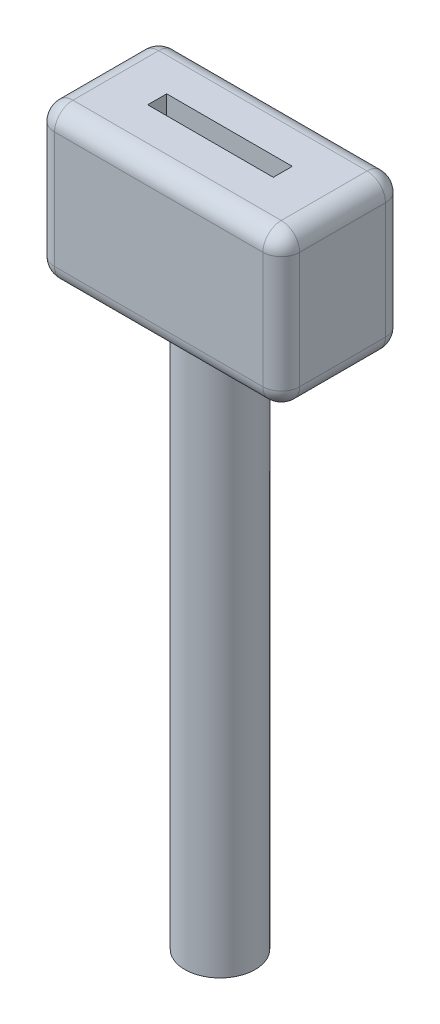
ISO-10303-21;
HEADER;
FILE_DESCRIPTION(('STEP AP214'),'2;1');
FILE_NAME('part.step','',(''),(''),'','','');
FILE_SCHEMA(('AUTOMOTIVE_DESIGN { 1 0 10303 214 1 1 1 1 }'));
ENDSEC;
DATA;
#1=APPLICATION_CONTEXT('core data for automotive mechanical design processes');
#2=APPLICATION_PROTOCOL_DEFINITION('international standard','automotive_design',2000,#1);
#3=PRODUCT_CONTEXT('',#1,'mechanical');
#4=PRODUCT('Part','Part','',(#3));
#5=PRODUCT_RELATED_PRODUCT_CATEGORY('part','',(#4));
#6=PRODUCT_DEFINITION_FORMATION('','',#4);
#7=PRODUCT_DEFINITION_CONTEXT('part definition',#1,'design');
#8=PRODUCT_DEFINITION('design','',#6,#7);
#9=PRODUCT_DEFINITION_SHAPE('','',#8);
#10=(LENGTH_UNIT() NAMED_UNIT(*) SI_UNIT(.MILLI.,.METRE.));
#11=(NAMED_UNIT(*) PLANE_ANGLE_UNIT() SI_UNIT($,.RADIAN.));
#12=(NAMED_UNIT(*) SI_UNIT($,.STERADIAN.) SOLID_ANGLE_UNIT());
#13=UNCERTAINTY_MEASURE_WITH_UNIT(LENGTH_MEASURE(1.E-05),#10,'distance_accuracy_value','');
#14=(GEOMETRIC_REPRESENTATION_CONTEXT(3) GLOBAL_UNCERTAINTY_ASSIGNED_CONTEXT((#13)) GLOBAL_UNIT_ASSIGNED_CONTEXT((#10,
#11,#12)) REPRESENTATION_CONTEXT('',''));
#15=CARTESIAN_POINT('',(0.,0.,0.));
#16=DIRECTION('',(0.,0.,1.));
#17=DIRECTION('',(1.,0.,0.));
#18=AXIS2_PLACEMENT_3D('',#15,#16,#17);
#19=CARTESIAN_POINT('',(0.,90.,0.));
#20=DIRECTION('',(0.,-1.,0.));
#21=DIRECTION('',(0.,0.,-1.));
#22=AXIS2_PLACEMENT_3D('',#19,#20,#21);
#23=CYLINDRICAL_SURFACE('',#22,5.75);
#24=CARTESIAN_POINT('',(0.,90.,0.));
#25=DIRECTION('',(0.,1.,0.));
#26=DIRECTION('',(0.,0.,1.));
#27=AXIS2_PLACEMENT_3D('',#24,#25,#26);
#28=CIRCLE('',#27,5.75);
#29=CARTESIAN_POINT('',(0.,90.,-5.75));
#30=VERTEX_POINT('',#29);
#31=EDGE_CURVE('E214',#30,#30,#28,.T.);
#32=CARTESIAN_POINT('',(0.,0.,0.));
#33=DIRECTION('',(0.,1.,0.));
#34=DIRECTION('',(0.,0.,1.));
#35=AXIS2_PLACEMENT_3D('',#32,#33,#34);
#36=CIRCLE('',#35,5.75);
#37=CARTESIAN_POINT('',(0.,0.,-5.75));
#38=VERTEX_POINT('',#37);
#39=EDGE_CURVE('E208',#38,#38,#36,.T.);
#40=CARTESIAN_POINT('',(0.,90.,-5.75));
#41=CARTESIAN_POINT('',(0.,89.0625,-5.75));
#42=CARTESIAN_POINT('',(0.,88.125,-5.75));
#43=CARTESIAN_POINT('',(0.,86.25,-5.75));
#44=CARTESIAN_POINT('',(0.,85.3125,-5.75));
#45=CARTESIAN_POINT('',(0.,83.4375,-5.75));
#46=CARTESIAN_POINT('',(0.,82.5,-5.75));
#47=CARTESIAN_POINT('',(0.,80.625,-5.75));
#48=CARTESIAN_POINT('',(0.,79.6875,-5.75));
#49=CARTESIAN_POINT('',(0.,77.8125,-5.75));
#50=CARTESIAN_POINT('',(0.,76.875,-5.75));
#51=CARTESIAN_POINT('',(0.,75.,-5.75));
#52=CARTESIAN_POINT('',(0.,74.0625,-5.75));
#53=CARTESIAN_POINT('',(0.,72.1875,-5.75));
#54=CARTESIAN_POINT('',(0.,71.25,-5.75));
#55=CARTESIAN_POINT('',(0.,69.375,-5.75));
#56=CARTESIAN_POINT('',(0.,68.4375,-5.75));
#57=CARTESIAN_POINT('',(0.,66.5625,-5.75));
#58=CARTESIAN_POINT('',(0.,65.625,-5.75));
#59=CARTESIAN_POINT('',(0.,63.75,-5.75));
#60=CARTESIAN_POINT('',(0.,62.8125,-5.75));
#61=CARTESIAN_POINT('',(0.,60.9375,-5.75));
#62=CARTESIAN_POINT('',(0.,60.,-5.75));
#63=CARTESIAN_POINT('',(0.,58.125,-5.75));
#64=CARTESIAN_POINT('',(0.,57.1875,-5.75));
#65=CARTESIAN_POINT('',(0.,55.3125,-5.75));
#66=CARTESIAN_POINT('',(0.,54.375,-5.75));
#67=CARTESIAN_POINT('',(0.,52.5,-5.75));
#68=CARTESIAN_POINT('',(0.,51.5625,-5.75));
#69=CARTESIAN_POINT('',(0.,49.6875,-5.75));
#70=CARTESIAN_POINT('',(0.,48.75,-5.75));
#71=CARTESIAN_POINT('',(0.,46.875,-5.75));
#72=CARTESIAN_POINT('',(0.,45.9375,-5.75));
#73=CARTESIAN_POINT('',(0.,44.0625,-5.75));
#74=CARTESIAN_POINT('',(0.,43.125,-5.75));
#75=CARTESIAN_POINT('',(0.,41.25,-5.75));
#76=CARTESIAN_POINT('',(0.,40.3125,-5.75));
#77=CARTESIAN_POINT('',(0.,38.4375,-5.75));
#78=CARTESIAN_POINT('',(0.,37.5,-5.75));
#79=CARTESIAN_POINT('',(0.,35.625,-5.75));
#80=CARTESIAN_POINT('',(0.,34.6875,-5.75));
#81=CARTESIAN_POINT('',(0.,32.8125,-5.75));
#82=CARTESIAN_POINT('',(0.,31.875,-5.75));
#83=CARTESIAN_POINT('',(0.,30.,-5.75));
#84=CARTESIAN_POINT('',(0.,29.0625,-5.75));
#85=CARTESIAN_POINT('',(0.,27.1875,-5.75));
#86=CARTESIAN_POINT('',(0.,26.25,-5.75));
#87=CARTESIAN_POINT('',(0.,24.375,-5.75));
#88=CARTESIAN_POINT('',(0.,23.4375,-5.75));
#89=CARTESIAN_POINT('',(0.,21.5625,-5.75));
#90=CARTESIAN_POINT('',(0.,20.625,-5.75));
#91=CARTESIAN_POINT('',(0.,18.75,-5.75));
#92=CARTESIAN_POINT('',(0.,17.8125,-5.75));
#93=CARTESIAN_POINT('',(0.,15.9375,-5.75));
#94=CARTESIAN_POINT('',(0.,15.,-5.75));
#95=CARTESIAN_POINT('',(0.,13.125,-5.75));
#96=CARTESIAN_POINT('',(0.,12.1875,-5.75));
#97=CARTESIAN_POINT('',(0.,10.3125,-5.75));
#98=CARTESIAN_POINT('',(0.,9.37499999999999,-5.75));
#99=CARTESIAN_POINT('',(0.,7.49999999999999,-5.75));
#100=CARTESIAN_POINT('',(0.,6.56249999999999,-5.75));
#101=CARTESIAN_POINT('',(0.,4.68749999999999,-5.75));
#102=CARTESIAN_POINT('',(0.,3.74999999999998,-5.75));
#103=CARTESIAN_POINT('',(0.,1.87499999999998,-5.75));
#104=CARTESIAN_POINT('',(0.,0.937499999999986,-5.75));
#105=CARTESIAN_POINT('',(0.,0.,-5.75));
#106=B_SPLINE_CURVE_WITH_KNOTS('',3,(#40,#41,#42,#43,#44,#45,#46,#47,#48,#49,#50,#51,#52,#53,
#54,#55,#56,#57,#58,#59,#60,#61,#62,#63,#64,#65,#66,#67,#68,#69,#70,#71,#72,#73,#74,#75,#76,#77,
#78,#79,#80,#81,#82,#83,#84,#85,#86,#87,#88,#89,#90,#91,#92,#93,#94,#95,#96,#97,#98,#99,#100,
#101,#102,#103,#104,#105),.UNSPECIFIED.,.F.,.F.,(4,2,2,2,2,2,2,2,2,2,2,2,2,2,2,2,2,2,2,2,2,2,2,
2,2,2,2,2,2,2,2,2,4),(0.,2.81250000000001,5.62500000000001,8.43750000000001,11.25,14.0625,
16.875,19.6875,22.5,25.3125,28.125,30.9375,33.75,36.5625,39.375,42.1875,45.,47.8125,50.625,
53.4375,56.25,59.0625,61.875,64.6875,67.5,70.3125,73.125,75.9375,78.75,81.5625,84.375,87.1875,
90.),.UNSPECIFIED.);
#107=EDGE_CURVE('BSEAM45',#30,#38,#106,.T.);
#108=ORIENTED_EDGE('',*,*,#31,.F.);
#109=ORIENTED_EDGE('',*,*,#39,.T.);
#110=ORIENTED_EDGE('',*,*,#107,.T.);
#111=ORIENTED_EDGE('',*,*,#107,.F.);
#112=EDGE_LOOP('',(#108,#110,#109,#111));
#113=FACE_BOUND('',#112,.T.);
#114=ADVANCED_FACE('F45',(#113),#23,.T.);
#115=CARTESIAN_POINT('',(0.,0.,0.));
#116=DIRECTION('',(0.,1.,0.));
#117=DIRECTION('',(0.,0.,1.));
#118=AXIS2_PLACEMENT_3D('',#115,#116,#117);
#119=PLANE('',#118);
#120=ORIENTED_EDGE('',*,*,#39,.F.);
#121=EDGE_LOOP('',(#120));
#122=FACE_BOUND('',#121,.T.);
#123=ADVANCED_FACE('F476',(#122),#119,.F.);
#124=CARTESIAN_POINT('',(20.,115.,10.));
#125=DIRECTION('',(-1.,0.,0.));
#126=DIRECTION('',(0.,0.,1.));
#127=AXIS2_PLACEMENT_3D('',#124,#125,#126);
#128=PLANE('',#127);
#129=DIRECTION('',(0.,0.,-1.));
#130=VECTOR('',#129,1.);
#131=CARTESIAN_POINT('',(20.,93.,-10.));
#132=LINE('',#131,#130);
#133=CARTESIAN_POINT('',(20.,93.,7.));
#134=VERTEX_POINT('',#133);
#135=CARTESIAN_POINT('',(20.,93.,-7.));
#136=VERTEX_POINT('',#135);
#137=EDGE_CURVE('E263',#134,#136,#132,.T.);
#138=ORIENTED_EDGE('',*,*,#137,.T.);
#139=DIRECTION('',(0.,-1.,0.));
#140=VECTOR('',#139,1.);
#141=CARTESIAN_POINT('',(20.,115.,-7.));
#142=LINE('',#141,#140);
#143=CARTESIAN_POINT('',(20.,112.,-7.));
#144=VERTEX_POINT('',#143);
#145=EDGE_CURVE('E270',#136,#144,#142,.F.);
#146=ORIENTED_EDGE('',*,*,#145,.T.);
#147=DIRECTION('',(0.,0.,-1.));
#148=VECTOR('',#147,1.);
#149=CARTESIAN_POINT('',(20.,112.,10.));
#150=LINE('',#149,#148);
#151=CARTESIAN_POINT('',(20.,112.,7.));
#152=VERTEX_POINT('',#151);
#153=EDGE_CURVE('E266',#144,#152,#150,.F.);
#154=ORIENTED_EDGE('',*,*,#153,.T.);
#155=DIRECTION('',(0.,-1.,0.));
#156=VECTOR('',#155,1.);
#157=CARTESIAN_POINT('',(20.,115.,7.));
#158=LINE('',#157,#156);
#159=EDGE_CURVE('E260',#152,#134,#158,.T.);
#160=ORIENTED_EDGE('',*,*,#159,.T.);
#161=EDGE_LOOP('',(#138,#146,#154,#160));
#162=FACE_BOUND('',#161,.T.);
#163=ADVANCED_FACE('F428',(#162),#128,.F.);
#164=CARTESIAN_POINT('',(-20.,115.,-10.));
#165=DIRECTION('',(0.,0.,1.));
#166=DIRECTION('',(1.,0.,0.));
#167=AXIS2_PLACEMENT_3D('',#164,#165,#166);
#168=PLANE('',#167);
#169=DIRECTION('',(-1.,0.,0.));
#170=VECTOR('',#169,1.);
#171=CARTESIAN_POINT('',(-20.,112.,-10.));
#172=LINE('',#171,#170);
#173=CARTESIAN_POINT('',(-17.,112.,-10.));
#174=VERTEX_POINT('',#173);
#175=CARTESIAN_POINT('',(17.,112.,-10.));
#176=VERTEX_POINT('',#175);
#177=EDGE_CURVE('E279',#174,#176,#172,.F.);
#178=ORIENTED_EDGE('',*,*,#177,.T.);
#179=DIRECTION('',(0.,-1.,0.));
#180=VECTOR('',#179,1.);
#181=CARTESIAN_POINT('',(17.,115.,-10.));
#182=LINE('',#181,#180);
#183=CARTESIAN_POINT('',(17.,93.,-10.));
#184=VERTEX_POINT('',#183);
#185=EDGE_CURVE('E282',#176,#184,#182,.T.);
#186=ORIENTED_EDGE('',*,*,#185,.T.);
#187=DIRECTION('',(-1.,0.,0.));
#188=VECTOR('',#187,1.);
#189=CARTESIAN_POINT('',(-20.,93.,-10.));
#190=LINE('',#189,#188);
#191=CARTESIAN_POINT('',(-17.,93.,-10.));
#192=VERTEX_POINT('',#191);
#193=EDGE_CURVE('E273',#184,#192,#190,.T.);
#194=ORIENTED_EDGE('',*,*,#193,.T.);
#195=DIRECTION('',(0.,-1.,0.));
#196=VECTOR('',#195,1.);
#197=CARTESIAN_POINT('',(-17.,115.,-10.));
#198=LINE('',#197,#196);
#199=EDGE_CURVE('E276',#192,#174,#198,.F.);
#200=ORIENTED_EDGE('',*,*,#199,.T.);
#201=EDGE_LOOP('',(#178,#186,#194,#200));
#202=FACE_BOUND('',#201,.T.);
#203=ADVANCED_FACE('F399',(#202),#168,.F.);
#204=CARTESIAN_POINT('',(-20.,115.,10.));
#205=DIRECTION('',(1.,0.,0.));
#206=DIRECTION('',(0.,0.,-1.));
#207=AXIS2_PLACEMENT_3D('',#204,#205,#206);
#208=PLANE('',#207);
#209=DIRECTION('',(0.,0.,1.));
#210=VECTOR('',#209,1.);
#211=CARTESIAN_POINT('',(-20.,112.,10.));
#212=LINE('',#211,#210);
#213=CARTESIAN_POINT('',(-20.,112.,7.));
#214=VERTEX_POINT('',#213);
#215=CARTESIAN_POINT('',(-20.,112.,-7.));
#216=VERTEX_POINT('',#215);
#217=EDGE_CURVE('E240',#214,#216,#212,.F.);
#218=ORIENTED_EDGE('',*,*,#217,.T.);
#219=DIRECTION('',(0.,-1.,0.));
#220=VECTOR('',#219,1.);
#221=CARTESIAN_POINT('',(-20.,115.,-7.));
#222=LINE('',#221,#220);
#223=CARTESIAN_POINT('',(-20.,93.,-7.));
#224=VERTEX_POINT('',#223);
#225=EDGE_CURVE('E244',#216,#224,#222,.T.);
#226=ORIENTED_EDGE('',*,*,#225,.T.);
#227=DIRECTION('',(0.,0.,1.));
#228=VECTOR('',#227,1.);
#229=CARTESIAN_POINT('',(-20.,93.,10.));
#230=LINE('',#229,#228);
#231=CARTESIAN_POINT('',(-20.,93.,7.));
#232=VERTEX_POINT('',#231);
#233=EDGE_CURVE('E237',#224,#232,#230,.T.);
#234=ORIENTED_EDGE('',*,*,#233,.T.);
#235=DIRECTION('',(0.,-1.,0.));
#236=VECTOR('',#235,1.);
#237=CARTESIAN_POINT('',(-20.,115.,7.));
#238=LINE('',#237,#236);
#239=EDGE_CURVE('E234',#232,#214,#238,.F.);
#240=ORIENTED_EDGE('',*,*,#239,.T.);
#241=EDGE_LOOP('',(#218,#226,#234,#240));
#242=FACE_BOUND('',#241,.T.);
#243=ADVANCED_FACE('F694',(#242),#208,.F.);
#244=CARTESIAN_POINT('',(-20.,115.,10.));
#245=DIRECTION('',(0.,0.,-1.));
#246=DIRECTION('',(-1.,0.,0.));
#247=AXIS2_PLACEMENT_3D('',#244,#245,#246);
#248=PLANE('',#247);
#249=DIRECTION('',(1.,0.,0.));
#250=VECTOR('',#249,1.);
#251=CARTESIAN_POINT('',(-20.,112.,10.));
#252=LINE('',#251,#250);
#253=CARTESIAN_POINT('',(17.,112.,10.));
#254=VERTEX_POINT('',#253);
#255=CARTESIAN_POINT('',(-17.,112.,10.));
#256=VERTEX_POINT('',#255);
#257=EDGE_CURVE('E55',#254,#256,#252,.F.);
#258=ORIENTED_EDGE('',*,*,#257,.T.);
#259=DIRECTION('',(0.,-1.,0.));
#260=VECTOR('',#259,1.);
#261=CARTESIAN_POINT('',(-17.,115.,10.));
#262=LINE('',#261,#260);
#263=CARTESIAN_POINT('',(-17.,93.,10.));
#264=VERTEX_POINT('',#263);
#265=EDGE_CURVE('E11',#256,#264,#262,.T.);
#266=ORIENTED_EDGE('',*,*,#265,.T.);
#267=DIRECTION('',(1.,0.,0.));
#268=VECTOR('',#267,1.);
#269=CARTESIAN_POINT('',(20.,93.,10.));
#270=LINE('',#269,#268);
#271=CARTESIAN_POINT('',(17.,93.,10.));
#272=VERTEX_POINT('',#271);
#273=EDGE_CURVE('E286',#264,#272,#270,.T.);
#274=ORIENTED_EDGE('',*,*,#273,.T.);
#275=DIRECTION('',(0.,-1.,0.));
#276=VECTOR('',#275,1.);
#277=CARTESIAN_POINT('',(17.,115.,10.));
#278=LINE('',#277,#276);
#279=EDGE_CURVE('E66',#272,#254,#278,.F.);
#280=ORIENTED_EDGE('',*,*,#279,.T.);
#281=EDGE_LOOP('',(#258,#266,#274,#280));
#282=FACE_BOUND('',#281,.T.);
#283=ADVANCED_FACE('F686',(#282),#248,.F.);
#284=CARTESIAN_POINT('',(0.,115.,0.));
#285=DIRECTION('',(0.,-1.,0.));
#286=DIRECTION('',(0.,0.,-1.));
#287=AXIS2_PLACEMENT_3D('',#284,#285,#286);
#288=PLANE('',#287);
#289=DIRECTION('',(0.,0.,-1.));
#290=VECTOR('',#289,1.);
#291=CARTESIAN_POINT('',(17.,115.,0.));
#292=LINE('',#291,#290);
#293=CARTESIAN_POINT('',(17.,115.,7.));
#294=VERTEX_POINT('',#293);
#295=CARTESIAN_POINT('',(17.,115.,-7.));
#296=VERTEX_POINT('',#295);
#297=EDGE_CURVE('E224',#294,#296,#292,.T.);
#298=ORIENTED_EDGE('',*,*,#297,.T.);
#299=DIRECTION('',(-1.,0.,0.));
#300=VECTOR('',#299,1.);
#301=CARTESIAN_POINT('',(0.,115.,-7.));
#302=LINE('',#301,#300);
#303=CARTESIAN_POINT('',(-17.,115.,-7.));
#304=VERTEX_POINT('',#303);
#305=EDGE_CURVE('E231',#296,#304,#302,.T.);
#306=ORIENTED_EDGE('',*,*,#305,.T.);
#307=DIRECTION('',(0.,0.,1.));
#308=VECTOR('',#307,1.);
#309=CARTESIAN_POINT('',(-17.,115.,0.));
#310=LINE('',#309,#308);
#311=CARTESIAN_POINT('',(-17.,115.,7.));
#312=VERTEX_POINT('',#311);
#313=EDGE_CURVE('E227',#304,#312,#310,.T.);
#314=ORIENTED_EDGE('',*,*,#313,.T.);
#315=DIRECTION('',(1.,0.,0.));
#316=VECTOR('',#315,1.);
#317=CARTESIAN_POINT('',(0.,115.,7.));
#318=LINE('',#317,#316);
#319=EDGE_CURVE('E218',#312,#294,#318,.T.);
#320=ORIENTED_EDGE('',*,*,#319,.T.);
#321=EDGE_LOOP('',(#298,#306,#314,#320));
#322=FACE_BOUND('',#321,.T.);
#323=DIRECTION('',(-1.,0.,0.));
#324=VECTOR('',#323,1.);
#325=CARTESIAN_POINT('',(-10.25,115.,-1.55));
#326=LINE('',#325,#324);
#327=CARTESIAN_POINT('',(10.25,115.,-1.55));
#328=VERTEX_POINT('',#327);
#329=CARTESIAN_POINT('',(-10.25,115.,-1.55));
#330=VERTEX_POINT('',#329);
#331=EDGE_CURVE('E199',#328,#330,#326,.T.);
#332=ORIENTED_EDGE('',*,*,#331,.F.);
#333=DIRECTION('',(0.,0.,-1.));
#334=VECTOR('',#333,1.);
#335=CARTESIAN_POINT('',(10.25,115.,1.55));
#336=LINE('',#335,#334);
#337=CARTESIAN_POINT('',(10.25,115.,1.55));
#338=VERTEX_POINT('',#337);
#339=EDGE_CURVE('E166',#338,#328,#336,.T.);
#340=ORIENTED_EDGE('',*,*,#339,.F.);
#341=DIRECTION('',(1.,0.,0.));
#342=VECTOR('',#341,1.);
#343=CARTESIAN_POINT('',(-10.25,115.,1.55));
#344=LINE('',#343,#342);
#345=CARTESIAN_POINT('',(-10.25,115.,1.55));
#346=VERTEX_POINT('',#345);
#347=EDGE_CURVE('E186',#346,#338,#344,.T.);
#348=ORIENTED_EDGE('',*,*,#347,.F.);
#349=DIRECTION('',(0.,0.,1.));
#350=VECTOR('',#349,1.);
#351=CARTESIAN_POINT('',(-10.25,115.,1.55));
#352=LINE('',#351,#350);
#353=EDGE_CURVE('E190',#330,#346,#352,.T.);
#354=ORIENTED_EDGE('',*,*,#353,.F.);
#355=EDGE_LOOP('',(#332,#340,#348,#354));
#356=FACE_BOUND('',#355,.T.);
#357=ADVANCED_FACE('F417',(#322,#356),#288,.F.);
#358=CARTESIAN_POINT('',(0.,90.,0.));
#359=DIRECTION('',(0.,-1.,0.));
#360=DIRECTION('',(0.,0.,-1.));
#361=AXIS2_PLACEMENT_3D('',#358,#359,#360);
#362=PLANE('',#361);
#363=DIRECTION('',(0.,0.,1.));
#364=VECTOR('',#363,1.);
#365=CARTESIAN_POINT('',(-17.,90.,-10.));
#366=LINE('',#365,#364);
#367=CARTESIAN_POINT('',(-17.,90.,7.));
#368=VERTEX_POINT('',#367);
#369=CARTESIAN_POINT('',(-17.,90.,-7.));
#370=VERTEX_POINT('',#369);
#371=EDGE_CURVE('E253',#368,#370,#366,.F.);
#372=ORIENTED_EDGE('',*,*,#371,.T.);
#373=DIRECTION('',(-1.,0.,0.));
#374=VECTOR('',#373,1.);
#375=CARTESIAN_POINT('',(20.,90.,-7.));
#376=LINE('',#375,#374);
#377=CARTESIAN_POINT('',(17.,90.,-7.));
#378=VERTEX_POINT('',#377);
#379=EDGE_CURVE('E257',#370,#378,#376,.F.);
#380=ORIENTED_EDGE('',*,*,#379,.T.);
#381=DIRECTION('',(0.,0.,-1.));
#382=VECTOR('',#381,1.);
#383=CARTESIAN_POINT('',(17.,90.,10.));
#384=LINE('',#383,#382);
#385=CARTESIAN_POINT('',(17.,90.,7.));
#386=VERTEX_POINT('',#385);
#387=EDGE_CURVE('E250',#378,#386,#384,.F.);
#388=ORIENTED_EDGE('',*,*,#387,.T.);
#389=DIRECTION('',(1.,0.,0.));
#390=VECTOR('',#389,1.);
#391=CARTESIAN_POINT('',(-20.,90.,7.));
#392=LINE('',#391,#390);
#393=EDGE_CURVE('E247',#386,#368,#392,.F.);
#394=ORIENTED_EDGE('',*,*,#393,.T.);
#395=EDGE_LOOP('',(#372,#380,#388,#394));
#396=FACE_BOUND('',#395,.T.);
#397=ORIENTED_EDGE('',*,*,#31,.T.);
#398=EDGE_LOOP('',(#397));
#399=FACE_BOUND('',#398,.T.);
#400=ADVANCED_FACE('F437',(#396,#399),#362,.T.);
#401=CARTESIAN_POINT('',(10.25,95.,1.55));
#402=DIRECTION('',(1.,0.,0.));
#403=DIRECTION('',(0.,0.,-1.));
#404=AXIS2_PLACEMENT_3D('',#401,#402,#403);
#405=PLANE('',#404);
#406=ORIENTED_EDGE('',*,*,#339,.T.);
#407=DIRECTION('',(0.,1.,0.));
#408=VECTOR('',#407,1.);
#409=CARTESIAN_POINT('',(10.25,95.,-1.55));
#410=LINE('',#409,#408);
#411=CARTESIAN_POINT('',(10.25,95.,-1.55));
#412=VERTEX_POINT('',#411);
#413=EDGE_CURVE('E159',#412,#328,#410,.T.);
#414=ORIENTED_EDGE('',*,*,#413,.F.);
#415=DIRECTION('',(0.,0.,-1.));
#416=VECTOR('',#415,1.);
#417=CARTESIAN_POINT('',(10.25,95.,1.55));
#418=LINE('',#417,#416);
#419=CARTESIAN_POINT('',(10.25,95.,1.55));
#420=VERTEX_POINT('',#419);
#421=EDGE_CURVE('E163',#420,#412,#418,.T.);
#422=ORIENTED_EDGE('',*,*,#421,.F.);
#423=DIRECTION('',(0.,1.,0.));
#424=VECTOR('',#423,1.);
#425=CARTESIAN_POINT('',(10.25,95.,1.55));
#426=LINE('',#425,#424);
#427=EDGE_CURVE('E205',#420,#338,#426,.T.);
#428=ORIENTED_EDGE('',*,*,#427,.T.);
#429=EDGE_LOOP('',(#406,#414,#422,#428));
#430=FACE_BOUND('',#429,.T.);
#431=ADVANCED_FACE('F161',(#430),#405,.F.);
#432=CARTESIAN_POINT('',(-10.25,95.,1.55));
#433=DIRECTION('',(0.,0.,1.));
#434=DIRECTION('',(1.,0.,0.));
#435=AXIS2_PLACEMENT_3D('',#432,#433,#434);
#436=PLANE('',#435);
#437=ORIENTED_EDGE('',*,*,#347,.T.);
#438=ORIENTED_EDGE('',*,*,#427,.F.);
#439=DIRECTION('',(1.,0.,0.));
#440=VECTOR('',#439,1.);
#441=CARTESIAN_POINT('',(-10.25,95.,1.55));
#442=LINE('',#441,#440);
#443=CARTESIAN_POINT('',(-10.25,95.,1.55));
#444=VERTEX_POINT('',#443);
#445=EDGE_CURVE('E172',#444,#420,#442,.T.);
#446=ORIENTED_EDGE('',*,*,#445,.F.);
#447=DIRECTION('',(0.,1.,0.));
#448=VECTOR('',#447,1.);
#449=CARTESIAN_POINT('',(-10.25,95.,1.55));
#450=LINE('',#449,#448);
#451=EDGE_CURVE('E209',#444,#346,#450,.T.);
#452=ORIENTED_EDGE('',*,*,#451,.T.);
#453=EDGE_LOOP('',(#437,#438,#446,#452));
#454=FACE_BOUND('',#453,.T.);
#455=ADVANCED_FACE('F655',(#454),#436,.F.);
#456=CARTESIAN_POINT('',(-10.25,95.,1.55));
#457=DIRECTION('',(-1.,0.,0.));
#458=DIRECTION('',(0.,0.,1.));
#459=AXIS2_PLACEMENT_3D('',#456,#457,#458);
#460=PLANE('',#459);
#461=ORIENTED_EDGE('',*,*,#353,.T.);
#462=ORIENTED_EDGE('',*,*,#451,.F.);
#463=DIRECTION('',(0.,0.,1.));
#464=VECTOR('',#463,1.);
#465=CARTESIAN_POINT('',(-10.25,95.,1.55));
#466=LINE('',#465,#464);
#467=CARTESIAN_POINT('',(-10.25,95.,-1.55));
#468=VERTEX_POINT('',#467);
#469=EDGE_CURVE('E181',#468,#444,#466,.T.);
#470=ORIENTED_EDGE('',*,*,#469,.F.);
#471=DIRECTION('',(0.,1.,0.));
#472=VECTOR('',#471,1.);
#473=CARTESIAN_POINT('',(-10.25,95.,-1.55));
#474=LINE('',#473,#472);
#475=EDGE_CURVE('E171',#468,#330,#474,.T.);
#476=ORIENTED_EDGE('',*,*,#475,.T.);
#477=EDGE_LOOP('',(#461,#462,#470,#476));
#478=FACE_BOUND('',#477,.T.);
#479=ADVANCED_FACE('F647',(#478),#460,.F.);
#480=CARTESIAN_POINT('',(-10.25,95.,-1.55));
#481=DIRECTION('',(0.,0.,-1.));
#482=DIRECTION('',(-1.,0.,0.));
#483=AXIS2_PLACEMENT_3D('',#480,#481,#482);
#484=PLANE('',#483);
#485=ORIENTED_EDGE('',*,*,#331,.T.);
#486=ORIENTED_EDGE('',*,*,#475,.F.);
#487=DIRECTION('',(-1.,0.,0.));
#488=VECTOR('',#487,1.);
#489=CARTESIAN_POINT('',(-10.25,95.,-1.55));
#490=LINE('',#489,#488);
#491=EDGE_CURVE('E175',#412,#468,#490,.T.);
#492=ORIENTED_EDGE('',*,*,#491,.F.);
#493=ORIENTED_EDGE('',*,*,#413,.T.);
#494=EDGE_LOOP('',(#485,#486,#492,#493));
#495=FACE_BOUND('',#494,.T.);
#496=ADVANCED_FACE('F176',(#495),#484,.F.);
#497=CARTESIAN_POINT('',(0.,95.,0.));
#498=DIRECTION('',(0.,-1.,0.));
#499=DIRECTION('',(0.,0.,-1.));
#500=AXIS2_PLACEMENT_3D('',#497,#498,#499);
#501=PLANE('',#500);
#502=ORIENTED_EDGE('',*,*,#421,.T.);
#503=ORIENTED_EDGE('',*,*,#491,.T.);
#504=ORIENTED_EDGE('',*,*,#469,.T.);
#505=ORIENTED_EDGE('',*,*,#445,.T.);
#506=EDGE_LOOP('',(#502,#503,#504,#505));
#507=FACE_BOUND('',#506,.T.);
#508=ADVANCED_FACE('F183',(#507),#501,.F.);
#509=CARTESIAN_POINT('',(17.,93.,10.));
#510=DIRECTION('',(0.,0.,1.));
#511=DIRECTION('',(1.,0.,0.));
#512=AXIS2_PLACEMENT_3D('',#509,#510,#511);
#513=CYLINDRICAL_SURFACE('',#512,3.);
#514=CARTESIAN_POINT('',(17.,93.,-7.));
#515=DIRECTION('',(0.,0.,-1.));
#516=DIRECTION('',(-1.,0.,0.));
#517=AXIS2_PLACEMENT_3D('',#514,#515,#516);
#518=CIRCLE('',#517,3.);
#519=EDGE_CURVE('E49',#136,#378,#518,.T.);
#520=ORIENTED_EDGE('',*,*,#519,.F.);
#521=ORIENTED_EDGE('',*,*,#137,.F.);
#522=CARTESIAN_POINT('',(17.,93.,7.));
#523=DIRECTION('',(0.,0.,1.));
#524=DIRECTION('',(1.,0.,0.));
#525=AXIS2_PLACEMENT_3D('',#522,#523,#524);
#526=CIRCLE('',#525,3.);
#527=EDGE_CURVE('E375',#386,#134,#526,.T.);
#528=ORIENTED_EDGE('',*,*,#527,.F.);
#529=ORIENTED_EDGE('',*,*,#387,.F.);
#530=EDGE_LOOP('',(#520,#521,#528,#529));
#531=FACE_BOUND('',#530,.T.);
#532=ADVANCED_FACE('F47',(#531),#513,.T.);
#533=CARTESIAN_POINT('',(17.,93.,-7.));
#534=DIRECTION('',(0.,-1.,0.));
#535=DIRECTION('',(0.,0.,-1.));
#536=AXIS2_PLACEMENT_3D('',#533,#534,#535);
#537=SPHERICAL_SURFACE('',#536,3.);
#538=CARTESIAN_POINT('',(17.,93.,-7.));
#539=DIRECTION('',(0.,-1.,0.));
#540=DIRECTION('',(0.,0.,-1.));
#541=AXIS2_PLACEMENT_3D('',#538,#539,#540);
#542=CIRCLE('',#541,3.);
#543=EDGE_CURVE('E368',#136,#184,#542,.F.);
#544=ORIENTED_EDGE('',*,*,#543,.F.);
#545=ORIENTED_EDGE('',*,*,#519,.T.);
#546=CARTESIAN_POINT('',(17.,93.,-7.));
#547=DIRECTION('',(1.,0.,0.));
#548=DIRECTION('',(0.,0.,-1.));
#549=AXIS2_PLACEMENT_3D('',#546,#547,#548);
#550=CIRCLE('',#549,3.);
#551=EDGE_CURVE('E372',#184,#378,#550,.F.);
#552=ORIENTED_EDGE('',*,*,#551,.F.);
#553=EDGE_LOOP('',(#544,#545,#552));
#554=FACE_BOUND('',#553,.T.);
#555=ADVANCED_FACE('F388',(#554),#537,.T.);
#556=CARTESIAN_POINT('',(17.,93.,7.));
#557=DIRECTION('',(1.,0.,0.));
#558=DIRECTION('',(0.,0.,-1.));
#559=AXIS2_PLACEMENT_3D('',#556,#557,#558);
#560=SPHERICAL_SURFACE('',#559,3.);
#561=CARTESIAN_POINT('',(17.,93.,7.));
#562=DIRECTION('',(1.,0.,0.));
#563=DIRECTION('',(0.,0.,-1.));
#564=AXIS2_PLACEMENT_3D('',#561,#562,#563);
#565=CIRCLE('',#564,3.);
#566=EDGE_CURVE('E360',#386,#272,#565,.F.);
#567=ORIENTED_EDGE('',*,*,#566,.F.);
#568=ORIENTED_EDGE('',*,*,#527,.T.);
#569=CARTESIAN_POINT('',(17.,93.,7.));
#570=DIRECTION('',(0.,-1.,0.));
#571=DIRECTION('',(0.,0.,-1.));
#572=AXIS2_PLACEMENT_3D('',#569,#570,#571);
#573=CIRCLE('',#572,3.);
#574=EDGE_CURVE('E364',#272,#134,#573,.F.);
#575=ORIENTED_EDGE('',*,*,#574,.F.);
#576=EDGE_LOOP('',(#567,#568,#575));
#577=FACE_BOUND('',#576,.T.);
#578=ADVANCED_FACE('F430',(#577),#560,.T.);
#579=CARTESIAN_POINT('',(-20.,93.,-7.));
#580=DIRECTION('',(1.,0.,0.));
#581=DIRECTION('',(0.,0.,-1.));
#582=AXIS2_PLACEMENT_3D('',#579,#580,#581);
#583=CYLINDRICAL_SURFACE('',#582,3.);
#584=ORIENTED_EDGE('',*,*,#551,.T.);
#585=ORIENTED_EDGE('',*,*,#379,.F.);
#586=CARTESIAN_POINT('',(-17.,93.,-7.));
#587=DIRECTION('',(-1.,0.,0.));
#588=DIRECTION('',(0.,0.,1.));
#589=AXIS2_PLACEMENT_3D('',#586,#587,#588);
#590=CIRCLE('',#589,3.);
#591=EDGE_CURVE('E353',#192,#370,#590,.T.);
#592=ORIENTED_EDGE('',*,*,#591,.F.);
#593=ORIENTED_EDGE('',*,*,#193,.F.);
#594=EDGE_LOOP('',(#584,#585,#592,#593));
#595=FACE_BOUND('',#594,.T.);
#596=ADVANCED_FACE('F395',(#595),#583,.T.);
#597=CARTESIAN_POINT('',(17.,115.,-7.));
#598=DIRECTION('',(0.,-1.,0.));
#599=DIRECTION('',(0.,0.,-1.));
#600=AXIS2_PLACEMENT_3D('',#597,#598,#599);
#601=CYLINDRICAL_SURFACE('',#600,3.);
#602=ORIENTED_EDGE('',*,*,#543,.T.);
#603=ORIENTED_EDGE('',*,*,#185,.F.);
#604=CARTESIAN_POINT('',(17.,112.,-7.));
#605=DIRECTION('',(0.,1.,0.));
#606=DIRECTION('',(0.,0.,1.));
#607=AXIS2_PLACEMENT_3D('',#604,#605,#606);
#608=CIRCLE('',#607,3.);
#609=EDGE_CURVE('E349',#144,#176,#608,.T.);
#610=ORIENTED_EDGE('',*,*,#609,.F.);
#611=ORIENTED_EDGE('',*,*,#145,.F.);
#612=EDGE_LOOP('',(#602,#603,#610,#611));
#613=FACE_BOUND('',#612,.T.);
#614=ADVANCED_FACE('F405',(#613),#601,.T.);
#615=CARTESIAN_POINT('',(17.,112.,0.));
#616=DIRECTION('',(0.,0.,-1.));
#617=DIRECTION('',(-1.,0.,0.));
#618=AXIS2_PLACEMENT_3D('',#615,#616,#617);
#619=CYLINDRICAL_SURFACE('',#618,3.);
#620=CARTESIAN_POINT('',(17.,112.,7.));
#621=DIRECTION('',(0.,0.,1.));
#622=DIRECTION('',(1.,0.,0.));
#623=AXIS2_PLACEMENT_3D('',#620,#621,#622);
#624=CIRCLE('',#623,3.);
#625=EDGE_CURVE('E341',#152,#294,#624,.T.);
#626=ORIENTED_EDGE('',*,*,#625,.F.);
#627=ORIENTED_EDGE('',*,*,#153,.F.);
#628=CARTESIAN_POINT('',(17.,112.,-7.));
#629=DIRECTION('',(0.,0.,-1.));
#630=DIRECTION('',(-1.,0.,0.));
#631=AXIS2_PLACEMENT_3D('',#628,#629,#630);
#632=CIRCLE('',#631,3.);
#633=EDGE_CURVE('E345',#296,#144,#632,.T.);
#634=ORIENTED_EDGE('',*,*,#633,.F.);
#635=ORIENTED_EDGE('',*,*,#297,.F.);
#636=EDGE_LOOP('',(#626,#627,#634,#635));
#637=FACE_BOUND('',#636,.T.);
#638=ADVANCED_FACE('F425',(#637),#619,.T.);
#639=CARTESIAN_POINT('',(17.,115.,7.));
#640=DIRECTION('',(0.,-1.,0.));
#641=DIRECTION('',(0.,0.,-1.));
#642=AXIS2_PLACEMENT_3D('',#639,#640,#641);
#643=CYLINDRICAL_SURFACE('',#642,3.);
#644=ORIENTED_EDGE('',*,*,#574,.T.);
#645=ORIENTED_EDGE('',*,*,#159,.F.);
#646=CARTESIAN_POINT('',(17.,112.,7.));
#647=DIRECTION('',(0.,1.,0.));
#648=DIRECTION('',(0.,0.,1.));
#649=AXIS2_PLACEMENT_3D('',#646,#647,#648);
#650=CIRCLE('',#649,3.);
#651=EDGE_CURVE('E338',#254,#152,#650,.T.);
#652=ORIENTED_EDGE('',*,*,#651,.F.);
#653=ORIENTED_EDGE('',*,*,#279,.F.);
#654=EDGE_LOOP('',(#644,#645,#652,#653));
#655=FACE_BOUND('',#654,.T.);
#656=ADVANCED_FACE('F466',(#655),#643,.T.);
#657=CARTESIAN_POINT('',(-20.,93.,7.));
#658=DIRECTION('',(-1.,0.,0.));
#659=DIRECTION('',(0.,0.,1.));
#660=AXIS2_PLACEMENT_3D('',#657,#658,#659);
#661=CYLINDRICAL_SURFACE('',#660,3.);
#662=ORIENTED_EDGE('',*,*,#566,.T.);
#663=ORIENTED_EDGE('',*,*,#273,.F.);
#664=CARTESIAN_POINT('',(-17.,93.,7.));
#665=DIRECTION('',(-1.,0.,0.));
#666=DIRECTION('',(0.,0.,1.));
#667=AXIS2_PLACEMENT_3D('',#664,#665,#666);
#668=CIRCLE('',#667,3.);
#669=EDGE_CURVE('E334',#368,#264,#668,.T.);
#670=ORIENTED_EDGE('',*,*,#669,.F.);
#671=ORIENTED_EDGE('',*,*,#393,.F.);
#672=EDGE_LOOP('',(#662,#663,#670,#671));
#673=FACE_BOUND('',#672,.T.);
#674=ADVANCED_FACE('F434',(#673),#661,.T.);
#675=CARTESIAN_POINT('',(-17.,93.,10.));
#676=DIRECTION('',(0.,0.,-1.));
#677=DIRECTION('',(-1.,0.,0.));
#678=AXIS2_PLACEMENT_3D('',#675,#676,#677);
#679=CYLINDRICAL_SURFACE('',#678,3.);
#680=CARTESIAN_POINT('',(-17.,93.,-7.));
#681=DIRECTION('',(0.,0.,-1.));
#682=DIRECTION('',(-1.,0.,0.));
#683=AXIS2_PLACEMENT_3D('',#680,#681,#682);
#684=CIRCLE('',#683,3.);
#685=EDGE_CURVE('E356',#370,#224,#684,.T.);
#686=ORIENTED_EDGE('',*,*,#685,.F.);
#687=ORIENTED_EDGE('',*,*,#371,.F.);
#688=CARTESIAN_POINT('',(-17.,93.,7.));
#689=DIRECTION('',(0.,0.,1.));
#690=DIRECTION('',(1.,0.,0.));
#691=AXIS2_PLACEMENT_3D('',#688,#689,#690);
#692=CIRCLE('',#691,3.);
#693=EDGE_CURVE('E330',#232,#368,#692,.T.);
#694=ORIENTED_EDGE('',*,*,#693,.F.);
#695=ORIENTED_EDGE('',*,*,#233,.F.);
#696=EDGE_LOOP('',(#686,#687,#694,#695));
#697=FACE_BOUND('',#696,.T.);
#698=ADVANCED_FACE('F442',(#697),#679,.T.);
#699=CARTESIAN_POINT('',(-17.,93.,-7.));
#700=DIRECTION('',(0.,-1.,0.));
#701=DIRECTION('',(0.,0.,-1.));
#702=AXIS2_PLACEMENT_3D('',#699,#700,#701);
#703=SPHERICAL_SURFACE('',#702,3.);
#704=ORIENTED_EDGE('',*,*,#591,.T.);
#705=ORIENTED_EDGE('',*,*,#685,.T.);
#706=CARTESIAN_POINT('',(-17.,93.,-7.));
#707=DIRECTION('',(0.,-1.,0.));
#708=DIRECTION('',(0.,0.,-1.));
#709=AXIS2_PLACEMENT_3D('',#706,#707,#708);
#710=CIRCLE('',#709,3.);
#711=EDGE_CURVE('E326',#192,#224,#710,.F.);
#712=ORIENTED_EDGE('',*,*,#711,.F.);
#713=EDGE_LOOP('',(#704,#705,#712));
#714=FACE_BOUND('',#713,.T.);
#715=ADVANCED_FACE('F446',(#714),#703,.T.);
#716=CARTESIAN_POINT('',(17.,112.,-7.));
#717=DIRECTION('',(1.,0.,0.));
#718=DIRECTION('',(0.,0.,-1.));
#719=AXIS2_PLACEMENT_3D('',#716,#717,#718);
#720=SPHERICAL_SURFACE('',#719,3.);
#721=ORIENTED_EDGE('',*,*,#633,.T.);
#722=ORIENTED_EDGE('',*,*,#609,.T.);
#723=CARTESIAN_POINT('',(17.,112.,-7.));
#724=DIRECTION('',(1.,0.,0.));
#725=DIRECTION('',(0.,1.,0.));
#726=AXIS2_PLACEMENT_3D('',#723,#724,#725);
#727=CIRCLE('',#726,3.);
#728=EDGE_CURVE('E322',#296,#176,#727,.F.);
#729=ORIENTED_EDGE('',*,*,#728,.F.);
#730=EDGE_LOOP('',(#721,#722,#729));
#731=FACE_BOUND('',#730,.T.);
#732=ADVANCED_FACE('F408',(#731),#720,.T.);
#733=CARTESIAN_POINT('',(17.,112.,7.));
#734=DIRECTION('',(1.,0.,0.));
#735=DIRECTION('',(0.,0.,-1.));
#736=AXIS2_PLACEMENT_3D('',#733,#734,#735);
#737=SPHERICAL_SURFACE('',#736,3.);
#738=ORIENTED_EDGE('',*,*,#651,.T.);
#739=ORIENTED_EDGE('',*,*,#625,.T.);
#740=CARTESIAN_POINT('',(17.,112.,7.));
#741=DIRECTION('',(1.,0.,0.));
#742=DIRECTION('',(0.,0.,-1.));
#743=AXIS2_PLACEMENT_3D('',#740,#741,#742);
#744=CIRCLE('',#743,3.);
#745=EDGE_CURVE('E318',#254,#294,#744,.F.);
#746=ORIENTED_EDGE('',*,*,#745,.F.);
#747=EDGE_LOOP('',(#738,#739,#746));
#748=FACE_BOUND('',#747,.T.);
#749=ADVANCED_FACE('F464',(#748),#737,.T.);
#750=CARTESIAN_POINT('',(-17.,93.,7.));
#751=DIRECTION('',(0.,-1.,0.));
#752=DIRECTION('',(0.,0.,-1.));
#753=AXIS2_PLACEMENT_3D('',#750,#751,#752);
#754=SPHERICAL_SURFACE('',#753,3.);
#755=ORIENTED_EDGE('',*,*,#693,.T.);
#756=ORIENTED_EDGE('',*,*,#669,.T.);
#757=CARTESIAN_POINT('',(-17.,93.,7.));
#758=DIRECTION('',(0.,-1.,0.));
#759=DIRECTION('',(0.,0.,-1.));
#760=AXIS2_PLACEMENT_3D('',#757,#758,#759);
#761=CIRCLE('',#760,3.);
#762=EDGE_CURVE('E315',#232,#264,#761,.F.);
#763=ORIENTED_EDGE('',*,*,#762,.F.);
#764=EDGE_LOOP('',(#755,#756,#763));
#765=FACE_BOUND('',#764,.T.);
#766=ADVANCED_FACE('F504',(#765),#754,.T.);
#767=CARTESIAN_POINT('',(-17.,115.,-7.));
#768=DIRECTION('',(0.,-1.,0.));
#769=DIRECTION('',(0.,0.,-1.));
#770=AXIS2_PLACEMENT_3D('',#767,#768,#769);
#771=CYLINDRICAL_SURFACE('',#770,3.);
#772=ORIENTED_EDGE('',*,*,#711,.T.);
#773=ORIENTED_EDGE('',*,*,#225,.F.);
#774=CARTESIAN_POINT('',(-17.,112.,-7.));
#775=DIRECTION('',(0.,1.,0.));
#776=DIRECTION('',(0.,0.,1.));
#777=AXIS2_PLACEMENT_3D('',#774,#775,#776);
#778=CIRCLE('',#777,3.);
#779=EDGE_CURVE('E311',#174,#216,#778,.T.);
#780=ORIENTED_EDGE('',*,*,#779,.F.);
#781=ORIENTED_EDGE('',*,*,#199,.F.);
#782=EDGE_LOOP('',(#772,#773,#780,#781));
#783=FACE_BOUND('',#782,.T.);
#784=ADVANCED_FACE('F449',(#783),#771,.T.);
#785=CARTESIAN_POINT('',(0.,112.,-7.));
#786=DIRECTION('',(-1.,0.,0.));
#787=DIRECTION('',(0.,0.,1.));
#788=AXIS2_PLACEMENT_3D('',#785,#786,#787);
#789=CYLINDRICAL_SURFACE('',#788,3.);
#790=ORIENTED_EDGE('',*,*,#728,.T.);
#791=ORIENTED_EDGE('',*,*,#177,.F.);
#792=CARTESIAN_POINT('',(-17.,112.,-7.));
#793=DIRECTION('',(-1.,0.,0.));
#794=DIRECTION('',(0.,0.,1.));
#795=AXIS2_PLACEMENT_3D('',#792,#793,#794);
#796=CIRCLE('',#795,3.);
#797=EDGE_CURVE('E307',#304,#174,#796,.T.);
#798=ORIENTED_EDGE('',*,*,#797,.F.);
#799=ORIENTED_EDGE('',*,*,#305,.F.);
#800=EDGE_LOOP('',(#790,#791,#798,#799));
#801=FACE_BOUND('',#800,.T.);
#802=ADVANCED_FACE('F412',(#801),#789,.T.);
#803=CARTESIAN_POINT('',(0.,112.,7.));
#804=DIRECTION('',(1.,0.,0.));
#805=DIRECTION('',(0.,0.,-1.));
#806=AXIS2_PLACEMENT_3D('',#803,#804,#805);
#807=CYLINDRICAL_SURFACE('',#806,3.);
#808=ORIENTED_EDGE('',*,*,#745,.T.);
#809=ORIENTED_EDGE('',*,*,#319,.F.);
#810=CARTESIAN_POINT('',(-17.,112.,7.));
#811=DIRECTION('',(-1.,0.,0.));
#812=DIRECTION('',(0.,0.,1.));
#813=AXIS2_PLACEMENT_3D('',#810,#811,#812);
#814=CIRCLE('',#813,3.);
#815=EDGE_CURVE('E303',#256,#312,#814,.T.);
#816=ORIENTED_EDGE('',*,*,#815,.F.);
#817=ORIENTED_EDGE('',*,*,#257,.F.);
#818=EDGE_LOOP('',(#808,#809,#816,#817));
#819=FACE_BOUND('',#818,.T.);
#820=ADVANCED_FACE('F461',(#819),#807,.T.);
#821=CARTESIAN_POINT('',(-17.,115.,7.));
#822=DIRECTION('',(0.,-1.,0.));
#823=DIRECTION('',(0.,0.,-1.));
#824=AXIS2_PLACEMENT_3D('',#821,#822,#823);
#825=CYLINDRICAL_SURFACE('',#824,3.);
#826=ORIENTED_EDGE('',*,*,#762,.T.);
#827=ORIENTED_EDGE('',*,*,#265,.F.);
#828=CARTESIAN_POINT('',(-17.,112.,7.));
#829=DIRECTION('',(0.,1.,0.));
#830=DIRECTION('',(0.,0.,1.));
#831=AXIS2_PLACEMENT_3D('',#828,#829,#830);
#832=CIRCLE('',#831,3.);
#833=EDGE_CURVE('E299',#214,#256,#832,.T.);
#834=ORIENTED_EDGE('',*,*,#833,.F.);
#835=ORIENTED_EDGE('',*,*,#239,.F.);
#836=EDGE_LOOP('',(#826,#827,#834,#835));
#837=FACE_BOUND('',#836,.T.);
#838=ADVANCED_FACE('F494',(#837),#825,.T.);
#839=CARTESIAN_POINT('',(-17.,112.,-7.));
#840=DIRECTION('',(0.,0.,-1.));
#841=DIRECTION('',(-1.,0.,0.));
#842=AXIS2_PLACEMENT_3D('',#839,#840,#841);
#843=SPHERICAL_SURFACE('',#842,3.);
#844=ORIENTED_EDGE('',*,*,#797,.T.);
#845=ORIENTED_EDGE('',*,*,#779,.T.);
#846=CARTESIAN_POINT('',(-17.,112.,-7.));
#847=DIRECTION('',(0.,0.,-1.));
#848=DIRECTION('',(0.,1.,0.));
#849=AXIS2_PLACEMENT_3D('',#846,#847,#848);
#850=CIRCLE('',#849,3.);
#851=EDGE_CURVE('E296',#304,#216,#850,.F.);
#852=ORIENTED_EDGE('',*,*,#851,.F.);
#853=EDGE_LOOP('',(#844,#845,#852));
#854=FACE_BOUND('',#853,.T.);
#855=ADVANCED_FACE('F451',(#854),#843,.T.);
#856=CARTESIAN_POINT('',(-17.,112.,7.));
#857=DIRECTION('',(0.,0.,1.));
#858=DIRECTION('',(1.,0.,0.));
#859=AXIS2_PLACEMENT_3D('',#856,#857,#858);
#860=SPHERICAL_SURFACE('',#859,3.);
#861=ORIENTED_EDGE('',*,*,#833,.T.);
#862=ORIENTED_EDGE('',*,*,#815,.T.);
#863=CARTESIAN_POINT('',(-17.,112.,7.));
#864=DIRECTION('',(0.,0.,1.));
#865=DIRECTION('',(1.,0.,0.));
#866=AXIS2_PLACEMENT_3D('',#863,#864,#865);
#867=CIRCLE('',#866,3.);
#868=EDGE_CURVE('E293',#214,#312,#867,.F.);
#869=ORIENTED_EDGE('',*,*,#868,.F.);
#870=EDGE_LOOP('',(#861,#862,#869));
#871=FACE_BOUND('',#870,.T.);
#872=ADVANCED_FACE('F458',(#871),#860,.T.);
#873=CARTESIAN_POINT('',(-17.,112.,0.));
#874=DIRECTION('',(0.,0.,1.));
#875=DIRECTION('',(1.,0.,0.));
#876=AXIS2_PLACEMENT_3D('',#873,#874,#875);
#877=CYLINDRICAL_SURFACE('',#876,3.);
#878=ORIENTED_EDGE('',*,*,#851,.T.);
#879=ORIENTED_EDGE('',*,*,#217,.F.);
#880=ORIENTED_EDGE('',*,*,#868,.T.);
#881=ORIENTED_EDGE('',*,*,#313,.F.);
#882=EDGE_LOOP('',(#878,#879,#880,#881));
#883=FACE_BOUND('',#882,.T.);
#884=ADVANCED_FACE('F454',(#883),#877,.T.);
#885=CLOSED_SHELL('',(#114,#123,#163,#203,#243,#283,#357,#400,#431,#455,#479,#496,#508,#532,
#555,#578,#596,#614,#638,#656,#674,#698,#715,#732,#749,#766,#784,#802,#820,#838,#855,#872,#884));
#886=MANIFOLD_SOLID_BREP('B2',#885);
#887=ADVANCED_BREP_SHAPE_REPRESENTATION('',(#18,#886),#14);
#888=SHAPE_DEFINITION_REPRESENTATION(#9,#887);
ENDSEC;
END-ISO-10303-21;
